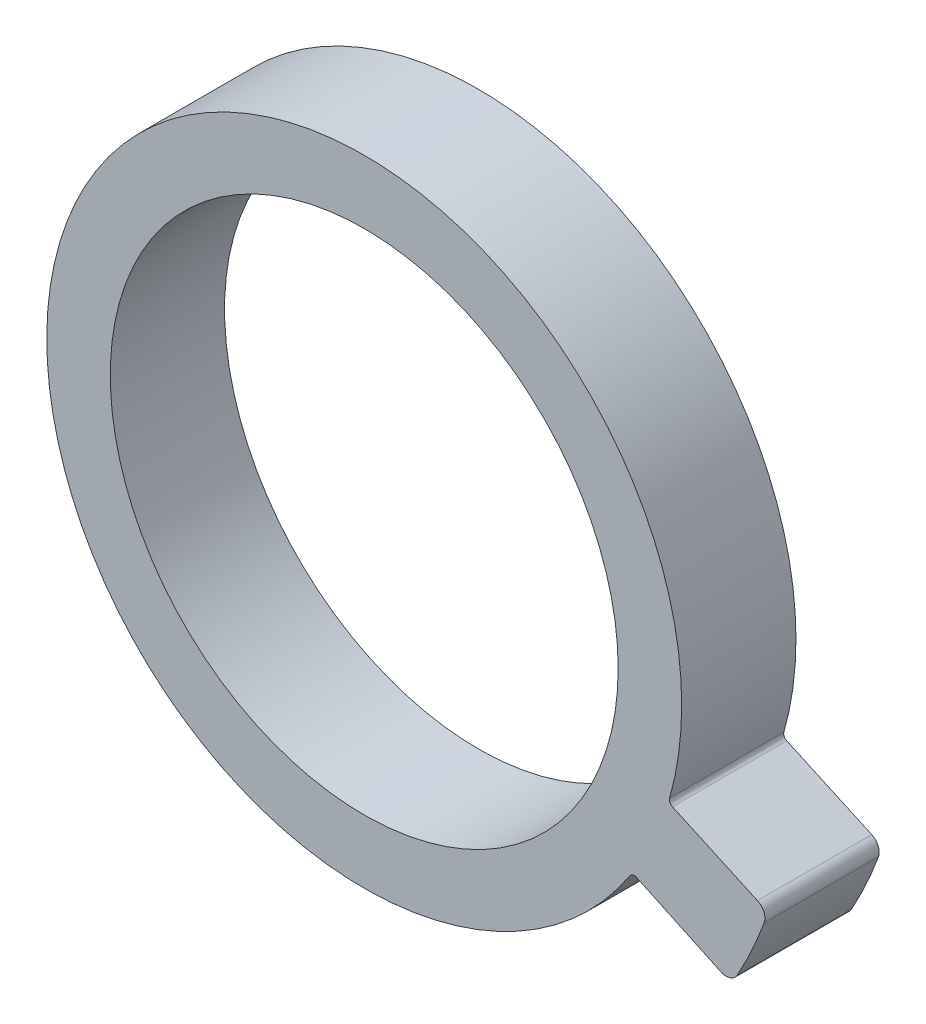
ISO-10303-21;
HEADER;
FILE_DESCRIPTION(('STEP AP214'),'2;1');
FILE_NAME('part.step','',(''),(''),'','','');
FILE_SCHEMA(('AUTOMOTIVE_DESIGN { 1 0 10303 214 1 1 1 1 }'));
ENDSEC;
DATA;
#1=APPLICATION_CONTEXT('core data for automotive mechanical design processes');
#2=APPLICATION_PROTOCOL_DEFINITION('international standard','automotive_design',2000,#1);
#3=PRODUCT_CONTEXT('',#1,'mechanical');
#4=PRODUCT('Part','Part','',(#3));
#5=PRODUCT_RELATED_PRODUCT_CATEGORY('part','',(#4));
#6=PRODUCT_DEFINITION_FORMATION('','',#4);
#7=PRODUCT_DEFINITION_CONTEXT('part definition',#1,'design');
#8=PRODUCT_DEFINITION('design','',#6,#7);
#9=PRODUCT_DEFINITION_SHAPE('','',#8);
#10=(LENGTH_UNIT() NAMED_UNIT(*) SI_UNIT(.MILLI.,.METRE.));
#11=(NAMED_UNIT(*) PLANE_ANGLE_UNIT() SI_UNIT($,.RADIAN.));
#12=(NAMED_UNIT(*) SI_UNIT($,.STERADIAN.) SOLID_ANGLE_UNIT());
#13=UNCERTAINTY_MEASURE_WITH_UNIT(LENGTH_MEASURE(1.E-05),#10,'distance_accuracy_value','');
#14=(GEOMETRIC_REPRESENTATION_CONTEXT(3) GLOBAL_UNCERTAINTY_ASSIGNED_CONTEXT((#13)) GLOBAL_UNIT_ASSIGNED_CONTEXT((#10,
#11,#12)) REPRESENTATION_CONTEXT('',''));
#15=CARTESIAN_POINT('',(0.,0.,0.));
#16=DIRECTION('',(0.,0.,1.));
#17=DIRECTION('',(1.,0.,0.));
#18=AXIS2_PLACEMENT_3D('',#15,#16,#17);
#19=CARTESIAN_POINT('',(15.2779729773756,-5.63171072795015,4.5));
#20=DIRECTION('',(0.,0.,1.));
#21=DIRECTION('',(1.,0.,0.));
#22=AXIS2_PLACEMENT_3D('',#19,#20,#21);
#23=PLANE('',#22);
#24=CARTESIAN_POINT('',(15.2779729773756,-5.63171072795015,4.5));
#25=DIRECTION('',(0.,0.,1.));
#26=DIRECTION('',(1.,0.,0.));
#27=AXIS2_PLACEMENT_3D('',#24,#25,#26);
#28=CIRCLE('',#27,0.499999999999998);
#29=CARTESIAN_POINT('',(15.747114806579,-5.80464407953859,4.5));
#30=VERTEX_POINT('',#29);
#31=CARTESIAN_POINT('',(15.4851855949086,-5.17666904729318,4.5));
#32=VERTEX_POINT('',#31);
#33=EDGE_CURVE('E147',#30,#32,#28,.T.);
#34=ORIENTED_EDGE('',*,*,#33,.T.);
#35=DIRECTION('',(-0.91008336131393,0.414425235066037,0.));
#36=VECTOR('',#35,1.);
#37=CARTESIAN_POINT('',(15.4851855949086,-5.17666904729318,4.5));
#38=LINE('',#37,#36);
#39=CARTESIAN_POINT('',(12.1342315429715,-3.65074298414162,4.5));
#40=VERTEX_POINT('',#39);
#41=EDGE_CURVE('E95',#32,#40,#38,.T.);
#42=ORIENTED_EDGE('',*,*,#41,.T.);
#43=CARTESIAN_POINT('',(12.2171165899847,-3.46872631187883,4.5));
#44=DIRECTION('',(0.,0.,-1.));
#45=DIRECTION('',(-1.,0.,0.));
#46=AXIS2_PLACEMENT_3D('',#43,#44,#45);
#47=CIRCLE('',#46,0.200000000000001);
#48=CARTESIAN_POINT('',(12.0247210531345,-3.41410070066815,4.5));
#49=VERTEX_POINT('',#48);
#50=EDGE_CURVE('E162',#40,#49,#47,.T.);
#51=ORIENTED_EDGE('',*,*,#50,.T.);
#52=CARTESIAN_POINT('',(0.,0.,4.5));
#53=DIRECTION('',(0.,0.,1.));
#54=DIRECTION('',(1.,0.,0.));
#55=AXIS2_PLACEMENT_3D('',#52,#53,#54);
#56=CIRCLE('',#55,12.5);
#57=CARTESIAN_POINT('',(10.4644302610838,-6.837082660822,4.5));
#58=VERTEX_POINT('',#57);
#59=EDGE_CURVE('E175',#49,#58,#56,.T.);
#60=ORIENTED_EDGE('',*,*,#59,.T.);
#61=CARTESIAN_POINT('',(10.6318611452612,-6.94647598339515,4.5));
#62=DIRECTION('',(0.,0.,-1.));
#63=DIRECTION('',(1.,0.,0.));
#64=AXIS2_PLACEMENT_3D('',#61,#62,#63);
#65=CIRCLE('',#64,0.2);
#66=CARTESIAN_POINT('',(10.7168303378893,-6.76542285223159,4.5));
#67=VERTEX_POINT('',#66);
#68=EDGE_CURVE('E114',#58,#67,#65,.T.);
#69=ORIENTED_EDGE('',*,*,#68,.T.);
#70=DIRECTION('',(0.905265655817804,-0.424845963140479,0.));
#71=VECTOR('',#70,1.);
#72=CARTESIAN_POINT('',(14.04074762561,-8.32535482626113,4.5));
#73=LINE('',#72,#71);
#74=CARTESIAN_POINT('',(14.04074762561,-8.32535482626113,4.5));
#75=VERTEX_POINT('',#74);
#76=EDGE_CURVE('E108',#67,#75,#73,.T.);
#77=ORIENTED_EDGE('',*,*,#76,.T.);
#78=CARTESIAN_POINT('',(14.2531706071803,-7.87272199835223,4.5));
#79=DIRECTION('',(0.,0.,1.));
#80=DIRECTION('',(1.,0.,0.));
#81=AXIS2_PLACEMENT_3D('',#78,#79,#80);
#82=CIRCLE('',#81,0.499999999999995);
#83=CARTESIAN_POINT('',(14.6908437553462,-8.11447024627666,4.5));
#84=VERTEX_POINT('',#83);
#85=EDGE_CURVE('E112',#75,#84,#82,.T.);
#86=ORIENTED_EDGE('',*,*,#85,.T.);
#87=CARTESIAN_POINT('',(0.,0.,4.5));
#88=DIRECTION('',(0.,0.,1.));
#89=DIRECTION('',(-1.,0.,0.));
#90=AXIS2_PLACEMENT_3D('',#87,#88,#89);
#91=CIRCLE('',#90,16.7828936009766);
#92=EDGE_CURVE('E52',#84,#30,#91,.T.);
#93=ORIENTED_EDGE('',*,*,#92,.T.);
#94=EDGE_LOOP('',(#34,#42,#51,#60,#69,#77,#86,#93));
#95=FACE_BOUND('',#94,.T.);
#96=CARTESIAN_POINT('',(0.,0.,4.5));
#97=DIRECTION('',(0.,0.,1.));
#98=DIRECTION('',(1.,0.,0.));
#99=AXIS2_PLACEMENT_3D('',#96,#97,#98);
#100=CIRCLE('',#99,10.);
#101=CARTESIAN_POINT('',(10.,0.,4.5));
#102=VERTEX_POINT('',#101);
#103=EDGE_CURVE('E136',#102,#102,#100,.T.);
#104=ORIENTED_EDGE('',*,*,#103,.F.);
#105=EDGE_LOOP('',(#104));
#106=FACE_BOUND('',#105,.T.);
#107=ADVANCED_FACE('F35',(#95,#106),#23,.T.);
#108=CARTESIAN_POINT('',(15.2779729773756,-5.63171072795015,0.));
#109=DIRECTION('',(0.,0.,1.));
#110=DIRECTION('',(1.,0.,0.));
#111=AXIS2_PLACEMENT_3D('',#108,#109,#110);
#112=PLANE('',#111);
#113=CARTESIAN_POINT('',(15.2779729773756,-5.63171072795015,0.));
#114=DIRECTION('',(0.,0.,1.));
#115=DIRECTION('',(1.,0.,0.));
#116=AXIS2_PLACEMENT_3D('',#113,#114,#115);
#117=CIRCLE('',#116,0.499999999999998);
#118=CARTESIAN_POINT('',(15.747114806579,-5.80464407953859,0.));
#119=VERTEX_POINT('',#118);
#120=CARTESIAN_POINT('',(15.4851855949086,-5.17666904729318,0.));
#121=VERTEX_POINT('',#120);
#122=EDGE_CURVE('E132',#119,#121,#117,.T.);
#123=ORIENTED_EDGE('',*,*,#122,.F.);
#124=CARTESIAN_POINT('',(0.,0.,0.));
#125=DIRECTION('',(0.,0.,1.));
#126=DIRECTION('',(-1.,0.,0.));
#127=AXIS2_PLACEMENT_3D('',#124,#125,#126);
#128=CIRCLE('',#127,16.7828936009766);
#129=CARTESIAN_POINT('',(14.6908437553462,-8.11447024627666,0.));
#130=VERTEX_POINT('',#129);
#131=EDGE_CURVE('E87',#130,#119,#128,.T.);
#132=ORIENTED_EDGE('',*,*,#131,.F.);
#133=CARTESIAN_POINT('',(14.2531706071803,-7.87272199835223,0.));
#134=DIRECTION('',(0.,0.,1.));
#135=DIRECTION('',(1.,0.,0.));
#136=AXIS2_PLACEMENT_3D('',#133,#134,#135);
#137=CIRCLE('',#136,0.499999999999995);
#138=CARTESIAN_POINT('',(14.04074762561,-8.32535482626113,0.));
#139=VERTEX_POINT('',#138);
#140=EDGE_CURVE('E81',#139,#130,#137,.T.);
#141=ORIENTED_EDGE('',*,*,#140,.F.);
#142=DIRECTION('',(0.905265655817804,-0.424845963140479,0.));
#143=VECTOR('',#142,1.);
#144=CARTESIAN_POINT('',(14.04074762561,-8.32535482626113,0.));
#145=LINE('',#144,#143);
#146=CARTESIAN_POINT('',(10.7168303378893,-6.76542285223159,0.));
#147=VERTEX_POINT('',#146);
#148=EDGE_CURVE('E122',#147,#139,#145,.T.);
#149=ORIENTED_EDGE('',*,*,#148,.F.);
#150=CARTESIAN_POINT('',(10.6318611452612,-6.94647598339515,0.));
#151=DIRECTION('',(0.,0.,-1.));
#152=DIRECTION('',(1.,0.,0.));
#153=AXIS2_PLACEMENT_3D('',#150,#151,#152);
#154=CIRCLE('',#153,0.2);
#155=CARTESIAN_POINT('',(10.4644302610838,-6.837082660822,0.));
#156=VERTEX_POINT('',#155);
#157=EDGE_CURVE('E142',#156,#147,#154,.T.);
#158=ORIENTED_EDGE('',*,*,#157,.F.);
#159=CARTESIAN_POINT('',(0.,0.,0.));
#160=DIRECTION('',(0.,0.,1.));
#161=DIRECTION('',(1.,0.,0.));
#162=AXIS2_PLACEMENT_3D('',#159,#160,#161);
#163=CIRCLE('',#162,12.5);
#164=CARTESIAN_POINT('',(12.0247210531345,-3.41410070066815,0.));
#165=VERTEX_POINT('',#164);
#166=EDGE_CURVE('E140',#165,#156,#163,.T.);
#167=ORIENTED_EDGE('',*,*,#166,.F.);
#168=CARTESIAN_POINT('',(12.2171165899847,-3.46872631187883,0.));
#169=DIRECTION('',(0.,0.,-1.));
#170=DIRECTION('',(-1.,0.,0.));
#171=AXIS2_PLACEMENT_3D('',#168,#169,#170);
#172=CIRCLE('',#171,0.200000000000001);
#173=CARTESIAN_POINT('',(12.1342315429715,-3.65074298414162,0.));
#174=VERTEX_POINT('',#173);
#175=EDGE_CURVE('E138',#174,#165,#172,.T.);
#176=ORIENTED_EDGE('',*,*,#175,.F.);
#177=DIRECTION('',(-0.91008336131393,0.414425235066037,0.));
#178=VECTOR('',#177,1.);
#179=CARTESIAN_POINT('',(15.4851855949086,-5.17666904729318,0.));
#180=LINE('',#179,#178);
#181=EDGE_CURVE('E135',#121,#174,#180,.T.);
#182=ORIENTED_EDGE('',*,*,#181,.F.);
#183=EDGE_LOOP('',(#123,#132,#141,#149,#158,#167,#176,#182));
#184=FACE_BOUND('',#183,.T.);
#185=CARTESIAN_POINT('',(0.,0.,0.));
#186=DIRECTION('',(0.,0.,1.));
#187=DIRECTION('',(1.,0.,0.));
#188=AXIS2_PLACEMENT_3D('',#185,#186,#187);
#189=CIRCLE('',#188,10.);
#190=CARTESIAN_POINT('',(10.,0.,0.));
#191=VERTEX_POINT('',#190);
#192=EDGE_CURVE('E181',#191,#191,#189,.T.);
#193=ORIENTED_EDGE('',*,*,#192,.T.);
#194=EDGE_LOOP('',(#193));
#195=FACE_BOUND('',#194,.T.);
#196=ADVANCED_FACE('F166',(#184,#195),#112,.F.);
#197=CARTESIAN_POINT('',(15.2779729773756,-5.63171072795015,4.5));
#198=DIRECTION('',(0.,0.,-1.));
#199=DIRECTION('',(-1.,0.,0.));
#200=AXIS2_PLACEMENT_3D('',#197,#198,#199);
#201=CYLINDRICAL_SURFACE('',#200,0.499999999999998);
#202=ORIENTED_EDGE('',*,*,#122,.T.);
#203=DIRECTION('',(0.,0.,-1.));
#204=VECTOR('',#203,1.);
#205=CARTESIAN_POINT('',(15.4851855949086,-5.17666904729318,4.5));
#206=LINE('',#205,#204);
#207=EDGE_CURVE('E11',#32,#121,#206,.T.);
#208=ORIENTED_EDGE('',*,*,#207,.F.);
#209=ORIENTED_EDGE('',*,*,#33,.F.);
#210=DIRECTION('',(0.,0.,-1.));
#211=VECTOR('',#210,1.);
#212=CARTESIAN_POINT('',(15.747114806579,-5.80464407953859,4.5));
#213=LINE('',#212,#211);
#214=EDGE_CURVE('E128',#30,#119,#213,.T.);
#215=ORIENTED_EDGE('',*,*,#214,.T.);
#216=EDGE_LOOP('',(#202,#208,#209,#215));
#217=FACE_BOUND('',#216,.T.);
#218=ADVANCED_FACE('F37',(#217),#201,.T.);
#219=CARTESIAN_POINT('',(15.4851855949086,-5.17666904729318,4.5));
#220=DIRECTION('',(-0.414425235066037,-0.910083361313929,0.));
#221=DIRECTION('',(0.910083361313929,-0.414425235066037,0.));
#222=AXIS2_PLACEMENT_3D('',#219,#220,#221);
#223=PLANE('',#222);
#224=ORIENTED_EDGE('',*,*,#181,.T.);
#225=DIRECTION('',(0.,0.,-1.));
#226=VECTOR('',#225,1.);
#227=CARTESIAN_POINT('',(12.1342315429715,-3.65074298414162,4.5));
#228=LINE('',#227,#226);
#229=EDGE_CURVE('E44',#40,#174,#228,.T.);
#230=ORIENTED_EDGE('',*,*,#229,.F.);
#231=ORIENTED_EDGE('',*,*,#41,.F.);
#232=ORIENTED_EDGE('',*,*,#207,.T.);
#233=EDGE_LOOP('',(#224,#230,#231,#232));
#234=FACE_BOUND('',#233,.T.);
#235=ADVANCED_FACE('F209',(#234),#223,.F.);
#236=CARTESIAN_POINT('',(12.2171165899847,-3.46872631187883,4.5));
#237=DIRECTION('',(0.,0.,-1.));
#238=DIRECTION('',(-1.,0.,0.));
#239=AXIS2_PLACEMENT_3D('',#236,#237,#238);
#240=CYLINDRICAL_SURFACE('',#239,0.200000000000001);
#241=ORIENTED_EDGE('',*,*,#175,.T.);
#242=DIRECTION('',(0.,0.,-1.));
#243=VECTOR('',#242,1.);
#244=CARTESIAN_POINT('',(12.0247210531345,-3.41410070066815,4.5));
#245=LINE('',#244,#243);
#246=EDGE_CURVE('E154',#49,#165,#245,.T.);
#247=ORIENTED_EDGE('',*,*,#246,.F.);
#248=ORIENTED_EDGE('',*,*,#50,.F.);
#249=ORIENTED_EDGE('',*,*,#229,.T.);
#250=EDGE_LOOP('',(#241,#247,#248,#249));
#251=FACE_BOUND('',#250,.T.);
#252=ADVANCED_FACE('F160',(#251),#240,.F.);
#253=CARTESIAN_POINT('',(0.,0.,4.5));
#254=DIRECTION('',(0.,0.,-1.));
#255=DIRECTION('',(-1.,0.,0.));
#256=AXIS2_PLACEMENT_3D('',#253,#254,#255);
#257=CYLINDRICAL_SURFACE('',#256,12.5);
#258=ORIENTED_EDGE('',*,*,#166,.T.);
#259=DIRECTION('',(0.,0.,-1.));
#260=VECTOR('',#259,1.);
#261=CARTESIAN_POINT('',(10.4644302610838,-6.837082660822,4.5));
#262=LINE('',#261,#260);
#263=EDGE_CURVE('E151',#58,#156,#262,.T.);
#264=ORIENTED_EDGE('',*,*,#263,.F.);
#265=ORIENTED_EDGE('',*,*,#59,.F.);
#266=ORIENTED_EDGE('',*,*,#246,.T.);
#267=EDGE_LOOP('',(#258,#264,#265,#266));
#268=FACE_BOUND('',#267,.T.);
#269=ADVANCED_FACE('F171',(#268),#257,.T.);
#270=CARTESIAN_POINT('',(10.6318611452612,-6.94647598339515,4.5));
#271=DIRECTION('',(0.,0.,-1.));
#272=DIRECTION('',(-1.,0.,0.));
#273=AXIS2_PLACEMENT_3D('',#270,#271,#272);
#274=CYLINDRICAL_SURFACE('',#273,0.2);
#275=ORIENTED_EDGE('',*,*,#157,.T.);
#276=DIRECTION('',(0.,0.,-1.));
#277=VECTOR('',#276,1.);
#278=CARTESIAN_POINT('',(10.7168303378893,-6.76542285223159,4.5));
#279=LINE('',#278,#277);
#280=EDGE_CURVE('E123',#67,#147,#279,.T.);
#281=ORIENTED_EDGE('',*,*,#280,.F.);
#282=ORIENTED_EDGE('',*,*,#68,.F.);
#283=ORIENTED_EDGE('',*,*,#263,.T.);
#284=EDGE_LOOP('',(#275,#281,#282,#283));
#285=FACE_BOUND('',#284,.T.);
#286=ADVANCED_FACE('F174',(#285),#274,.F.);
#287=CARTESIAN_POINT('',(14.04074762561,-8.32535482626113,4.5));
#288=DIRECTION('',(0.424845963140479,0.905265655817804,0.));
#289=DIRECTION('',(-0.905265655817804,0.424845963140479,0.));
#290=AXIS2_PLACEMENT_3D('',#287,#288,#289);
#291=PLANE('',#290);
#292=ORIENTED_EDGE('',*,*,#148,.T.);
#293=DIRECTION('',(0.,0.,-1.));
#294=VECTOR('',#293,1.);
#295=CARTESIAN_POINT('',(14.04074762561,-8.32535482626113,4.5));
#296=LINE('',#295,#294);
#297=EDGE_CURVE('E119',#75,#139,#296,.T.);
#298=ORIENTED_EDGE('',*,*,#297,.F.);
#299=ORIENTED_EDGE('',*,*,#76,.F.);
#300=ORIENTED_EDGE('',*,*,#280,.T.);
#301=EDGE_LOOP('',(#292,#298,#299,#300));
#302=FACE_BOUND('',#301,.T.);
#303=ADVANCED_FACE('F120',(#302),#291,.F.);
#304=CARTESIAN_POINT('',(14.2531706071803,-7.87272199835223,4.5));
#305=DIRECTION('',(0.,0.,-1.));
#306=DIRECTION('',(-1.,0.,0.));
#307=AXIS2_PLACEMENT_3D('',#304,#305,#306);
#308=CYLINDRICAL_SURFACE('',#307,0.499999999999995);
#309=ORIENTED_EDGE('',*,*,#140,.T.);
#310=DIRECTION('',(0.,0.,-1.));
#311=VECTOR('',#310,1.);
#312=CARTESIAN_POINT('',(14.6908437553462,-8.11447024627666,4.5));
#313=LINE('',#312,#311);
#314=EDGE_CURVE('E124',#84,#130,#313,.T.);
#315=ORIENTED_EDGE('',*,*,#314,.F.);
#316=ORIENTED_EDGE('',*,*,#85,.F.);
#317=ORIENTED_EDGE('',*,*,#297,.T.);
#318=EDGE_LOOP('',(#309,#315,#316,#317));
#319=FACE_BOUND('',#318,.T.);
#320=ADVANCED_FACE('F126',(#319),#308,.T.);
#321=CARTESIAN_POINT('',(0.,0.,4.5));
#322=DIRECTION('',(0.,0.,-1.));
#323=DIRECTION('',(-1.,0.,0.));
#324=AXIS2_PLACEMENT_3D('',#321,#322,#323);
#325=CYLINDRICAL_SURFACE('',#324,16.7828936009766);
#326=ORIENTED_EDGE('',*,*,#131,.T.);
#327=ORIENTED_EDGE('',*,*,#214,.F.);
#328=ORIENTED_EDGE('',*,*,#92,.F.);
#329=ORIENTED_EDGE('',*,*,#314,.T.);
#330=EDGE_LOOP('',(#326,#327,#328,#329));
#331=FACE_BOUND('',#330,.T.);
#332=ADVANCED_FACE('F197',(#331),#325,.T.);
#333=CARTESIAN_POINT('',(0.,0.,4.5));
#334=DIRECTION('',(0.,0.,-1.));
#335=DIRECTION('',(-1.,0.,0.));
#336=AXIS2_PLACEMENT_3D('',#333,#334,#335);
#337=CYLINDRICAL_SURFACE('',#336,10.);
#338=ORIENTED_EDGE('',*,*,#103,.T.);
#339=EDGE_LOOP('',(#338));
#340=FACE_BOUND('',#339,.T.);
#341=ORIENTED_EDGE('',*,*,#192,.F.);
#342=EDGE_LOOP('',(#341));
#343=FACE_BOUND('',#342,.T.);
#344=ADVANCED_FACE('F187',(#340,#343),#337,.F.);
#345=CLOSED_SHELL('',(#107,#196,#218,#235,#252,#269,#286,#303,#320,#332,#344));
#346=MANIFOLD_SOLID_BREP('B2',#345);
#347=ADVANCED_BREP_SHAPE_REPRESENTATION('',(#18,#346),#14);
#348=SHAPE_DEFINITION_REPRESENTATION(#9,#347);
ENDSEC;
END-ISO-10303-21;
